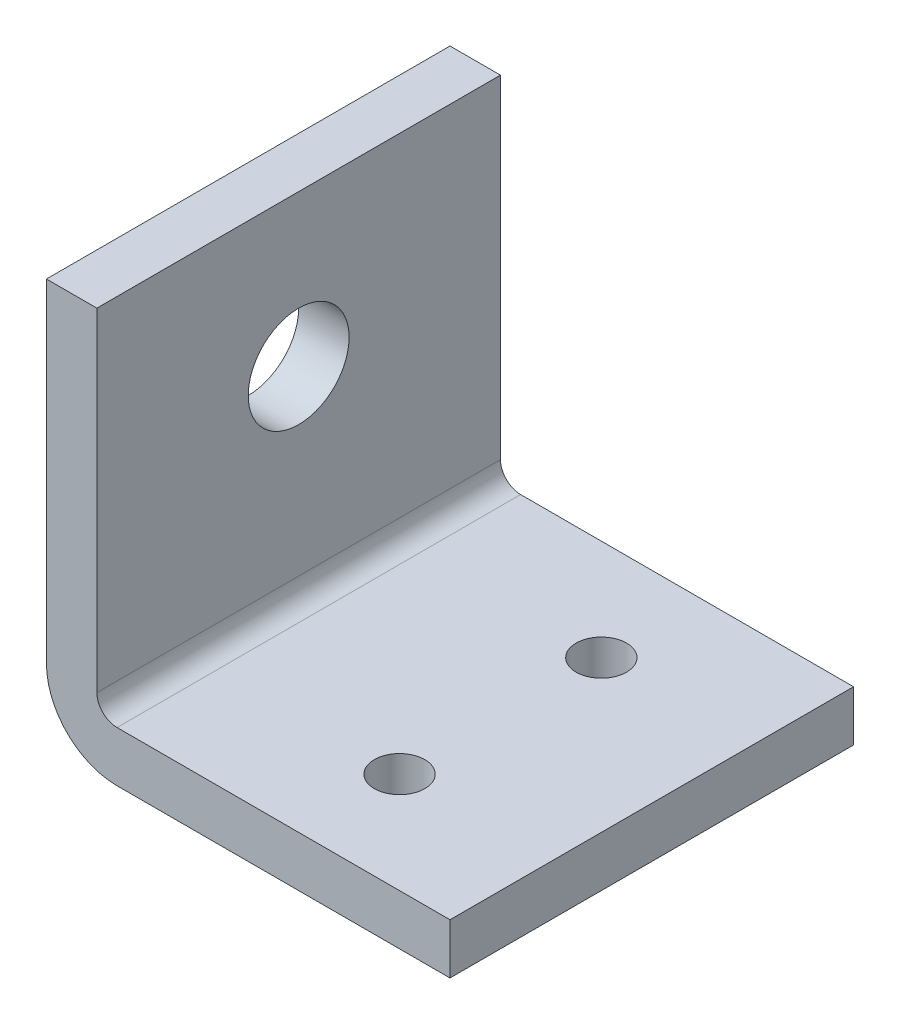
ISO-10303-21;
HEADER;
FILE_DESCRIPTION(('STEP AP214'),'2;1');
FILE_NAME('part.step','',(''),(''),'','','');
FILE_SCHEMA(('AUTOMOTIVE_DESIGN { 1 0 10303 214 1 1 1 1 }'));
ENDSEC;
DATA;
#1=APPLICATION_CONTEXT('core data for automotive mechanical design processes');
#2=APPLICATION_PROTOCOL_DEFINITION('international standard','automotive_design',2000,#1);
#3=PRODUCT_CONTEXT('',#1,'mechanical');
#4=PRODUCT('Part','Part','',(#3));
#5=PRODUCT_RELATED_PRODUCT_CATEGORY('part','',(#4));
#6=PRODUCT_DEFINITION_FORMATION('','',#4);
#7=PRODUCT_DEFINITION_CONTEXT('part definition',#1,'design');
#8=PRODUCT_DEFINITION('design','',#6,#7);
#9=PRODUCT_DEFINITION_SHAPE('','',#8);
#10=(LENGTH_UNIT() NAMED_UNIT(*) SI_UNIT(.MILLI.,.METRE.));
#11=(NAMED_UNIT(*) PLANE_ANGLE_UNIT() SI_UNIT($,.RADIAN.));
#12=(NAMED_UNIT(*) SI_UNIT($,.STERADIAN.) SOLID_ANGLE_UNIT());
#13=UNCERTAINTY_MEASURE_WITH_UNIT(LENGTH_MEASURE(1.E-05),#10,'distance_accuracy_value','');
#14=(GEOMETRIC_REPRESENTATION_CONTEXT(3) GLOBAL_UNCERTAINTY_ASSIGNED_CONTEXT((#13)) GLOBAL_UNIT_ASSIGNED_CONTEXT((#10,
#11,#12)) REPRESENTATION_CONTEXT('',''));
#15=CARTESIAN_POINT('',(0.,0.,0.));
#16=DIRECTION('',(0.,0.,1.));
#17=DIRECTION('',(1.,0.,0.));
#18=AXIS2_PLACEMENT_3D('',#15,#16,#17);
#19=CARTESIAN_POINT('',(-15.,-15.,-20.));
#20=DIRECTION('',(0.,-1.,0.));
#21=DIRECTION('',(0.,0.,-1.));
#22=AXIS2_PLACEMENT_3D('',#19,#20,#21);
#23=PLANE('',#22);
#24=CARTESIAN_POINT('',(5.,-15.,10.));
#25=DIRECTION('',(0.,1.,0.));
#26=DIRECTION('',(0.,0.,1.));
#27=AXIS2_PLACEMENT_3D('',#24,#25,#26);
#28=CIRCLE('',#27,2.50000000000001);
#29=CARTESIAN_POINT('',(5.,-15.,12.5));
#30=VERTEX_POINT('',#29);
#31=EDGE_CURVE('E211',#30,#30,#28,.T.);
#32=ORIENTED_EDGE('',*,*,#31,.F.);
#33=EDGE_LOOP('',(#32));
#34=FACE_BOUND('',#33,.T.);
#35=DIRECTION('',(1.,0.,0.));
#36=VECTOR('',#35,1.);
#37=CARTESIAN_POINT('',(-15.,-15.,-20.));
#38=LINE('',#37,#36);
#39=CARTESIAN_POINT('',(-13.,-15.,-20.));
#40=VERTEX_POINT('',#39);
#41=CARTESIAN_POINT('',(20.,-15.,-20.));
#42=VERTEX_POINT('',#41);
#43=EDGE_CURVE('E121',#40,#42,#38,.T.);
#44=ORIENTED_EDGE('',*,*,#43,.F.);
#45=DIRECTION('',(0.,0.,1.));
#46=VECTOR('',#45,1.);
#47=CARTESIAN_POINT('',(-13.,-15.,20.));
#48=LINE('',#47,#46);
#49=CARTESIAN_POINT('',(-13.,-15.,20.));
#50=VERTEX_POINT('',#49);
#51=EDGE_CURVE('E160',#40,#50,#48,.T.);
#52=ORIENTED_EDGE('',*,*,#51,.T.);
#53=DIRECTION('',(1.,0.,0.));
#54=VECTOR('',#53,1.);
#55=CARTESIAN_POINT('',(0.,-15.,20.));
#56=LINE('',#55,#54);
#57=CARTESIAN_POINT('',(20.,-15.,20.));
#58=VERTEX_POINT('',#57);
#59=EDGE_CURVE('E132',#50,#58,#56,.T.);
#60=ORIENTED_EDGE('',*,*,#59,.T.);
#61=DIRECTION('',(0.,0.,1.));
#62=VECTOR('',#61,1.);
#63=CARTESIAN_POINT('',(20.,-15.,-20.));
#64=LINE('',#63,#62);
#65=EDGE_CURVE('E133',#42,#58,#64,.T.);
#66=ORIENTED_EDGE('',*,*,#65,.F.);
#67=EDGE_LOOP('',(#44,#52,#60,#66));
#68=FACE_BOUND('',#67,.T.);
#69=CARTESIAN_POINT('',(5.,-15.,-10.));
#70=DIRECTION('',(0.,1.,0.));
#71=DIRECTION('',(0.,0.,1.));
#72=AXIS2_PLACEMENT_3D('',#69,#70,#71);
#73=CIRCLE('',#72,2.50000000000001);
#74=CARTESIAN_POINT('',(5.,-15.,-7.49999999999999));
#75=VERTEX_POINT('',#74);
#76=EDGE_CURVE('E219',#75,#75,#73,.T.);
#77=ORIENTED_EDGE('',*,*,#76,.F.);
#78=EDGE_LOOP('',(#77));
#79=FACE_BOUND('',#78,.T.);
#80=ADVANCED_FACE('F45',(#34,#68,#79),#23,.F.);
#81=CARTESIAN_POINT('',(20.,20.,20.));
#82=DIRECTION('',(-1.,0.,0.));
#83=DIRECTION('',(0.,-1.,0.));
#84=AXIS2_PLACEMENT_3D('',#81,#82,#83);
#85=PLANE('',#84);
#86=DIRECTION('',(0.,1.,0.));
#87=VECTOR('',#86,1.);
#88=CARTESIAN_POINT('',(20.,20.,-20.));
#89=LINE('',#88,#87);
#90=CARTESIAN_POINT('',(20.,-20.,-20.));
#91=VERTEX_POINT('',#90);
#92=EDGE_CURVE('E138',#91,#42,#89,.T.);
#93=ORIENTED_EDGE('',*,*,#92,.T.);
#94=ORIENTED_EDGE('',*,*,#65,.T.);
#95=DIRECTION('',(0.,1.,0.));
#96=VECTOR('',#95,1.);
#97=CARTESIAN_POINT('',(20.,20.,20.));
#98=LINE('',#97,#96);
#99=CARTESIAN_POINT('',(20.,-20.,20.));
#100=VERTEX_POINT('',#99);
#101=EDGE_CURVE('E151',#100,#58,#98,.T.);
#102=ORIENTED_EDGE('',*,*,#101,.F.);
#103=DIRECTION('',(0.,0.,-1.));
#104=VECTOR('',#103,1.);
#105=CARTESIAN_POINT('',(20.,-20.,20.));
#106=LINE('',#105,#104);
#107=EDGE_CURVE('E152',#100,#91,#106,.T.);
#108=ORIENTED_EDGE('',*,*,#107,.T.);
#109=EDGE_LOOP('',(#93,#94,#102,#108));
#110=FACE_BOUND('',#109,.T.);
#111=ADVANCED_FACE('F227',(#110),#85,.F.);
#112=CARTESIAN_POINT('',(-20.,20.,20.));
#113=DIRECTION('',(0.,-1.,0.));
#114=DIRECTION('',(0.,0.,-1.));
#115=AXIS2_PLACEMENT_3D('',#112,#113,#114);
#116=PLANE('',#115);
#117=DIRECTION('',(-1.,0.,0.));
#118=VECTOR('',#117,1.);
#119=CARTESIAN_POINT('',(-20.,20.,20.));
#120=LINE('',#119,#118);
#121=CARTESIAN_POINT('',(-15.,20.,20.));
#122=VERTEX_POINT('',#121);
#123=CARTESIAN_POINT('',(-20.,20.,20.));
#124=VERTEX_POINT('',#123);
#125=EDGE_CURVE('E130',#122,#124,#120,.T.);
#126=ORIENTED_EDGE('',*,*,#125,.F.);
#127=DIRECTION('',(0.,0.,1.));
#128=VECTOR('',#127,1.);
#129=CARTESIAN_POINT('',(-15.,20.,-20.));
#130=LINE('',#129,#128);
#131=CARTESIAN_POINT('',(-15.,20.,-20.));
#132=VERTEX_POINT('',#131);
#133=EDGE_CURVE('E114',#132,#122,#130,.T.);
#134=ORIENTED_EDGE('',*,*,#133,.F.);
#135=DIRECTION('',(-1.,0.,0.));
#136=VECTOR('',#135,1.);
#137=CARTESIAN_POINT('',(-20.,20.,-20.));
#138=LINE('',#137,#136);
#139=CARTESIAN_POINT('',(-20.,20.,-20.));
#140=VERTEX_POINT('',#139);
#141=EDGE_CURVE('E128',#132,#140,#138,.T.);
#142=ORIENTED_EDGE('',*,*,#141,.T.);
#143=DIRECTION('',(0.,0.,-1.));
#144=VECTOR('',#143,1.);
#145=CARTESIAN_POINT('',(-20.,20.,20.));
#146=LINE('',#145,#144);
#147=EDGE_CURVE('E156',#124,#140,#146,.T.);
#148=ORIENTED_EDGE('',*,*,#147,.F.);
#149=EDGE_LOOP('',(#126,#134,#142,#148));
#150=FACE_BOUND('',#149,.T.);
#151=ADVANCED_FACE('F126',(#150),#116,.F.);
#152=CARTESIAN_POINT('',(-20.,20.,20.));
#153=DIRECTION('',(1.,0.,0.));
#154=DIRECTION('',(0.,1.,0.));
#155=AXIS2_PLACEMENT_3D('',#152,#153,#154);
#156=PLANE('',#155);
#157=CARTESIAN_POINT('',(-20.,5.,0.));
#158=DIRECTION('',(1.,0.,0.));
#159=DIRECTION('',(0.,0.,-1.));
#160=AXIS2_PLACEMENT_3D('',#157,#158,#159);
#161=CIRCLE('',#160,5.00000000000001);
#162=CARTESIAN_POINT('',(-20.,5.,-5.00000000000001));
#163=VERTEX_POINT('',#162);
#164=EDGE_CURVE('E122',#163,#163,#161,.T.);
#165=ORIENTED_EDGE('',*,*,#164,.T.);
#166=EDGE_LOOP('',(#165));
#167=FACE_BOUND('',#166,.T.);
#168=DIRECTION('',(0.,-1.,0.));
#169=VECTOR('',#168,1.);
#170=CARTESIAN_POINT('',(-20.,20.,-20.));
#171=LINE('',#170,#169);
#172=CARTESIAN_POINT('',(-20.,-13.,-20.));
#173=VERTEX_POINT('',#172);
#174=EDGE_CURVE('E136',#140,#173,#171,.T.);
#175=ORIENTED_EDGE('',*,*,#174,.T.);
#176=DIRECTION('',(0.,0.,-1.));
#177=VECTOR('',#176,1.);
#178=CARTESIAN_POINT('',(-20.,-13.,20.));
#179=LINE('',#178,#177);
#180=CARTESIAN_POINT('',(-20.,-13.,20.));
#181=VERTEX_POINT('',#180);
#182=EDGE_CURVE('E54',#173,#181,#179,.F.);
#183=ORIENTED_EDGE('',*,*,#182,.T.);
#184=DIRECTION('',(0.,-1.,0.));
#185=VECTOR('',#184,1.);
#186=CARTESIAN_POINT('',(-20.,20.,20.));
#187=LINE('',#186,#185);
#188=EDGE_CURVE('E180',#124,#181,#187,.T.);
#189=ORIENTED_EDGE('',*,*,#188,.F.);
#190=ORIENTED_EDGE('',*,*,#147,.T.);
#191=EDGE_LOOP('',(#175,#183,#189,#190));
#192=FACE_BOUND('',#191,.T.);
#193=ADVANCED_FACE('F254',(#167,#192),#156,.F.);
#194=CARTESIAN_POINT('',(-20.,-20.,20.));
#195=DIRECTION('',(0.,1.,0.));
#196=DIRECTION('',(0.,0.,1.));
#197=AXIS2_PLACEMENT_3D('',#194,#195,#196);
#198=PLANE('',#197);
#199=CARTESIAN_POINT('',(5.,-20.,-10.));
#200=DIRECTION('',(0.,1.,0.));
#201=DIRECTION('',(0.,0.,1.));
#202=AXIS2_PLACEMENT_3D('',#199,#200,#201);
#203=CIRCLE('',#202,2.50000000000001);
#204=CARTESIAN_POINT('',(5.,-20.,-7.49999999999999));
#205=VERTEX_POINT('',#204);
#206=EDGE_CURVE('E215',#205,#205,#203,.T.);
#207=ORIENTED_EDGE('',*,*,#206,.T.);
#208=EDGE_LOOP('',(#207));
#209=FACE_BOUND('',#208,.T.);
#210=CARTESIAN_POINT('',(5.,-20.,10.));
#211=DIRECTION('',(0.,1.,0.));
#212=DIRECTION('',(0.,0.,1.));
#213=AXIS2_PLACEMENT_3D('',#210,#211,#212);
#214=CIRCLE('',#213,2.50000000000001);
#215=CARTESIAN_POINT('',(5.,-20.,12.5));
#216=VERTEX_POINT('',#215);
#217=EDGE_CURVE('E207',#216,#216,#214,.T.);
#218=ORIENTED_EDGE('',*,*,#217,.T.);
#219=EDGE_LOOP('',(#218));
#220=FACE_BOUND('',#219,.T.);
#221=DIRECTION('',(1.,0.,0.));
#222=VECTOR('',#221,1.);
#223=CARTESIAN_POINT('',(-20.,-20.,20.));
#224=LINE('',#223,#222);
#225=CARTESIAN_POINT('',(-13.,-20.,20.));
#226=VERTEX_POINT('',#225);
#227=EDGE_CURVE('E157',#226,#100,#224,.T.);
#228=ORIENTED_EDGE('',*,*,#227,.F.);
#229=DIRECTION('',(0.,0.,-1.));
#230=VECTOR('',#229,1.);
#231=CARTESIAN_POINT('',(-13.,-20.,20.));
#232=LINE('',#231,#230);
#233=CARTESIAN_POINT('',(-13.,-20.,-20.));
#234=VERTEX_POINT('',#233);
#235=EDGE_CURVE('E172',#226,#234,#232,.T.);
#236=ORIENTED_EDGE('',*,*,#235,.T.);
#237=DIRECTION('',(1.,0.,0.));
#238=VECTOR('',#237,1.);
#239=CARTESIAN_POINT('',(-20.,-20.,-20.));
#240=LINE('',#239,#238);
#241=EDGE_CURVE('E142',#234,#91,#240,.T.);
#242=ORIENTED_EDGE('',*,*,#241,.T.);
#243=ORIENTED_EDGE('',*,*,#107,.F.);
#244=EDGE_LOOP('',(#228,#236,#242,#243));
#245=FACE_BOUND('',#244,.T.);
#246=ADVANCED_FACE('F250',(#209,#220,#245),#198,.F.);
#247=CARTESIAN_POINT('',(0.,0.,20.));
#248=DIRECTION('',(0.,0.,1.));
#249=DIRECTION('',(1.,0.,0.));
#250=AXIS2_PLACEMENT_3D('',#247,#248,#249);
#251=PLANE('',#250);
#252=ORIENTED_EDGE('',*,*,#188,.T.);
#253=CARTESIAN_POINT('',(-13.,-13.,20.));
#254=DIRECTION('',(0.,0.,1.));
#255=DIRECTION('',(1.,0.,0.));
#256=AXIS2_PLACEMENT_3D('',#253,#254,#255);
#257=CIRCLE('',#256,7.);
#258=EDGE_CURVE('E11',#181,#226,#257,.T.);
#259=ORIENTED_EDGE('',*,*,#258,.T.);
#260=ORIENTED_EDGE('',*,*,#227,.T.);
#261=ORIENTED_EDGE('',*,*,#101,.T.);
#262=ORIENTED_EDGE('',*,*,#59,.F.);
#263=CARTESIAN_POINT('',(-13.,-13.,20.));
#264=DIRECTION('',(0.,0.,1.));
#265=DIRECTION('',(1.,0.,0.));
#266=AXIS2_PLACEMENT_3D('',#263,#264,#265);
#267=CIRCLE('',#266,2.);
#268=CARTESIAN_POINT('',(-15.,-13.,20.));
#269=VERTEX_POINT('',#268);
#270=EDGE_CURVE('E166',#50,#269,#267,.F.);
#271=ORIENTED_EDGE('',*,*,#270,.T.);
#272=DIRECTION('',(0.,-1.,0.));
#273=VECTOR('',#272,1.);
#274=CARTESIAN_POINT('',(-15.,0.,20.));
#275=LINE('',#274,#273);
#276=EDGE_CURVE('E145',#122,#269,#275,.T.);
#277=ORIENTED_EDGE('',*,*,#276,.F.);
#278=ORIENTED_EDGE('',*,*,#125,.T.);
#279=EDGE_LOOP('',(#252,#259,#260,#261,#262,#271,#277,#278));
#280=FACE_BOUND('',#279,.T.);
#281=ADVANCED_FACE('F247',(#280),#251,.T.);
#282=CARTESIAN_POINT('',(0.,0.,-20.));
#283=DIRECTION('',(0.,0.,1.));
#284=DIRECTION('',(1.,0.,0.));
#285=AXIS2_PLACEMENT_3D('',#282,#283,#284);
#286=PLANE('',#285);
#287=ORIENTED_EDGE('',*,*,#241,.F.);
#288=CARTESIAN_POINT('',(-13.,-13.,-20.));
#289=DIRECTION('',(0.,0.,1.));
#290=DIRECTION('',(1.,0.,0.));
#291=AXIS2_PLACEMENT_3D('',#288,#289,#290);
#292=CIRCLE('',#291,7.);
#293=EDGE_CURVE('E68',#234,#173,#292,.F.);
#294=ORIENTED_EDGE('',*,*,#293,.T.);
#295=ORIENTED_EDGE('',*,*,#174,.F.);
#296=ORIENTED_EDGE('',*,*,#141,.F.);
#297=DIRECTION('',(0.,-1.,0.));
#298=VECTOR('',#297,1.);
#299=CARTESIAN_POINT('',(-15.,20.,-20.));
#300=LINE('',#299,#298);
#301=CARTESIAN_POINT('',(-15.,-13.,-20.));
#302=VERTEX_POINT('',#301);
#303=EDGE_CURVE('E110',#132,#302,#300,.T.);
#304=ORIENTED_EDGE('',*,*,#303,.T.);
#305=CARTESIAN_POINT('',(-13.,-13.,-20.));
#306=DIRECTION('',(0.,0.,1.));
#307=DIRECTION('',(1.,0.,0.));
#308=AXIS2_PLACEMENT_3D('',#305,#306,#307);
#309=CIRCLE('',#308,2.);
#310=EDGE_CURVE('E169',#302,#40,#309,.T.);
#311=ORIENTED_EDGE('',*,*,#310,.T.);
#312=ORIENTED_EDGE('',*,*,#43,.T.);
#313=ORIENTED_EDGE('',*,*,#92,.F.);
#314=EDGE_LOOP('',(#287,#294,#295,#296,#304,#311,#312,#313));
#315=FACE_BOUND('',#314,.T.);
#316=ADVANCED_FACE('F135',(#315),#286,.F.);
#317=CARTESIAN_POINT('',(-15.,20.,-20.));
#318=DIRECTION('',(-1.,0.,0.));
#319=DIRECTION('',(0.,-1.,0.));
#320=AXIS2_PLACEMENT_3D('',#317,#318,#319);
#321=PLANE('',#320);
#322=CARTESIAN_POINT('',(-15.,5.,0.));
#323=DIRECTION('',(1.,0.,0.));
#324=DIRECTION('',(0.,0.,-1.));
#325=AXIS2_PLACEMENT_3D('',#322,#323,#324);
#326=CIRCLE('',#325,5.00000000000001);
#327=CARTESIAN_POINT('',(-15.,5.,-5.00000000000001));
#328=VERTEX_POINT('',#327);
#329=EDGE_CURVE('E203',#328,#328,#326,.T.);
#330=ORIENTED_EDGE('',*,*,#329,.F.);
#331=EDGE_LOOP('',(#330));
#332=FACE_BOUND('',#331,.T.);
#333=ORIENTED_EDGE('',*,*,#276,.T.);
#334=DIRECTION('',(0.,0.,1.));
#335=VECTOR('',#334,1.);
#336=CARTESIAN_POINT('',(-15.,-13.,-20.));
#337=LINE('',#336,#335);
#338=EDGE_CURVE('E117',#269,#302,#337,.F.);
#339=ORIENTED_EDGE('',*,*,#338,.T.);
#340=ORIENTED_EDGE('',*,*,#303,.F.);
#341=ORIENTED_EDGE('',*,*,#133,.T.);
#342=EDGE_LOOP('',(#333,#339,#340,#341));
#343=FACE_BOUND('',#342,.T.);
#344=ADVANCED_FACE('F113',(#332,#343),#321,.F.);
#345=CARTESIAN_POINT('',(-13.,-13.,-20.));
#346=DIRECTION('',(0.,0.,-1.));
#347=DIRECTION('',(-1.,0.,0.));
#348=AXIS2_PLACEMENT_3D('',#345,#346,#347);
#349=CYLINDRICAL_SURFACE('',#348,2.);
#350=ORIENTED_EDGE('',*,*,#310,.F.);
#351=ORIENTED_EDGE('',*,*,#338,.F.);
#352=ORIENTED_EDGE('',*,*,#270,.F.);
#353=ORIENTED_EDGE('',*,*,#51,.F.);
#354=EDGE_LOOP('',(#350,#351,#352,#353));
#355=FACE_BOUND('',#354,.T.);
#356=ADVANCED_FACE('F245',(#355),#349,.F.);
#357=CARTESIAN_POINT('',(-13.,-13.,20.));
#358=DIRECTION('',(0.,0.,-1.));
#359=DIRECTION('',(-1.,0.,0.));
#360=AXIS2_PLACEMENT_3D('',#357,#358,#359);
#361=CYLINDRICAL_SURFACE('',#360,7.);
#362=ORIENTED_EDGE('',*,*,#258,.F.);
#363=ORIENTED_EDGE('',*,*,#182,.F.);
#364=ORIENTED_EDGE('',*,*,#293,.F.);
#365=ORIENTED_EDGE('',*,*,#235,.F.);
#366=EDGE_LOOP('',(#362,#363,#364,#365));
#367=FACE_BOUND('',#366,.T.);
#368=ADVANCED_FACE('F47',(#367),#361,.T.);
#369=CARTESIAN_POINT('',(-15.,5.,0.));
#370=DIRECTION('',(1.,0.,0.));
#371=DIRECTION('',(0.,0.,-1.));
#372=AXIS2_PLACEMENT_3D('',#369,#370,#371);
#373=CYLINDRICAL_SURFACE('',#372,5.00000000000001);
#374=ORIENTED_EDGE('',*,*,#164,.F.);
#375=EDGE_LOOP('',(#374));
#376=FACE_BOUND('',#375,.T.);
#377=ORIENTED_EDGE('',*,*,#329,.T.);
#378=EDGE_LOOP('',(#377));
#379=FACE_BOUND('',#378,.T.);
#380=ADVANCED_FACE('F241',(#376,#379),#373,.F.);
#381=CARTESIAN_POINT('',(5.,-15.,10.));
#382=DIRECTION('',(0.,1.,0.));
#383=DIRECTION('',(0.,0.,1.));
#384=AXIS2_PLACEMENT_3D('',#381,#382,#383);
#385=CYLINDRICAL_SURFACE('',#384,2.50000000000001);
#386=ORIENTED_EDGE('',*,*,#217,.F.);
#387=EDGE_LOOP('',(#386));
#388=FACE_BOUND('',#387,.T.);
#389=ORIENTED_EDGE('',*,*,#31,.T.);
#390=EDGE_LOOP('',(#389));
#391=FACE_BOUND('',#390,.T.);
#392=ADVANCED_FACE('F278',(#388,#391),#385,.F.);
#393=CARTESIAN_POINT('',(5.,-15.,-10.));
#394=DIRECTION('',(0.,1.,0.));
#395=DIRECTION('',(0.,0.,1.));
#396=AXIS2_PLACEMENT_3D('',#393,#394,#395);
#397=CYLINDRICAL_SURFACE('',#396,2.50000000000001);
#398=ORIENTED_EDGE('',*,*,#206,.F.);
#399=EDGE_LOOP('',(#398));
#400=FACE_BOUND('',#399,.T.);
#401=ORIENTED_EDGE('',*,*,#76,.T.);
#402=EDGE_LOOP('',(#401));
#403=FACE_BOUND('',#402,.T.);
#404=ADVANCED_FACE('F224',(#400,#403),#397,.F.);
#405=CLOSED_SHELL('',(#80,#111,#151,#193,#246,#281,#316,#344,#356,#368,#380,#392,#404));
#406=MANIFOLD_SOLID_BREP('B2',#405);
#407=ADVANCED_BREP_SHAPE_REPRESENTATION('',(#18,#406),#14);
#408=SHAPE_DEFINITION_REPRESENTATION(#9,#407);
ENDSEC;
END-ISO-10303-21;
